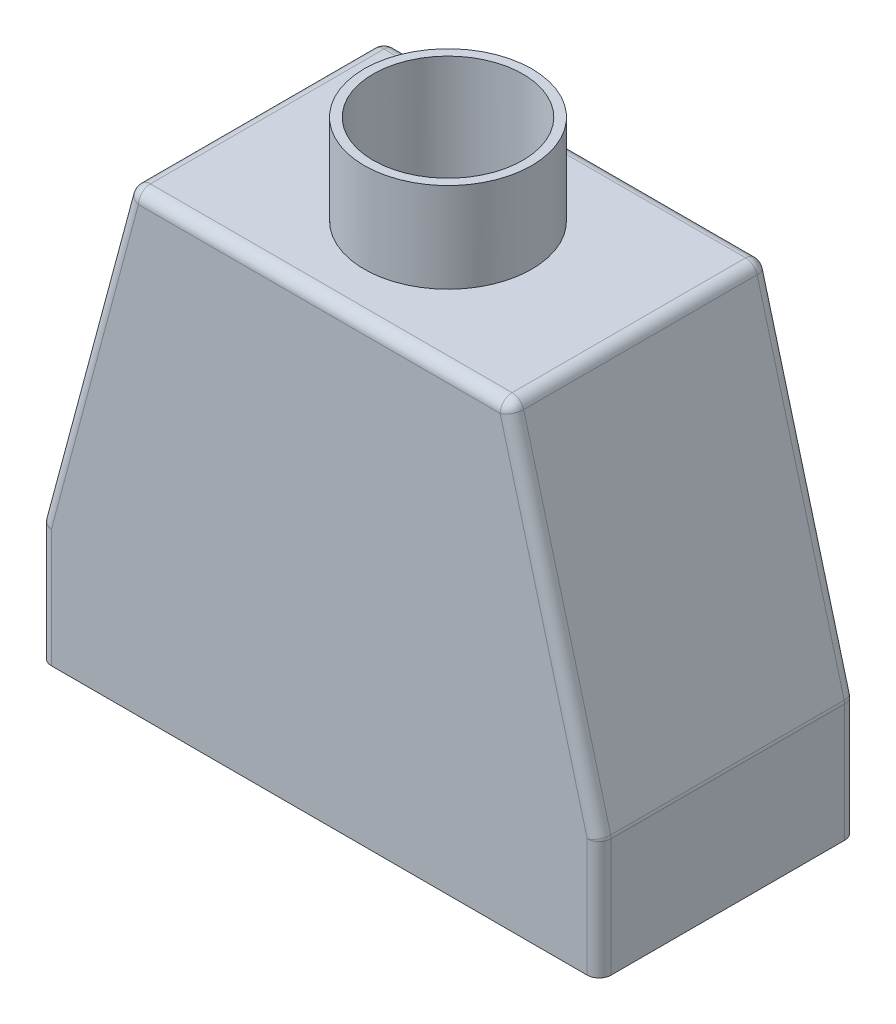
ISO-10303-21;
HEADER;
FILE_DESCRIPTION(('STEP AP214'),'2;1');
FILE_NAME('part.step','',(''),(''),'','','');
FILE_SCHEMA(('AUTOMOTIVE_DESIGN { 1 0 10303 214 1 1 1 1 }'));
ENDSEC;
DATA;
#1=APPLICATION_CONTEXT('core data for automotive mechanical design processes');
#2=APPLICATION_PROTOCOL_DEFINITION('international standard','automotive_design',2000,#1);
#3=PRODUCT_CONTEXT('',#1,'mechanical');
#4=PRODUCT('Part','Part','',(#3));
#5=PRODUCT_RELATED_PRODUCT_CATEGORY('part','',(#4));
#6=PRODUCT_DEFINITION_FORMATION('','',#4);
#7=PRODUCT_DEFINITION_CONTEXT('part definition',#1,'design');
#8=PRODUCT_DEFINITION('design','',#6,#7);
#9=PRODUCT_DEFINITION_SHAPE('','',#8);
#10=(LENGTH_UNIT() NAMED_UNIT(*) SI_UNIT(.MILLI.,.METRE.));
#11=(NAMED_UNIT(*) PLANE_ANGLE_UNIT() SI_UNIT($,.RADIAN.));
#12=(NAMED_UNIT(*) SI_UNIT($,.STERADIAN.) SOLID_ANGLE_UNIT());
#13=UNCERTAINTY_MEASURE_WITH_UNIT(LENGTH_MEASURE(1.E-05),#10,'distance_accuracy_value','');
#14=(GEOMETRIC_REPRESENTATION_CONTEXT(3) GLOBAL_UNCERTAINTY_ASSIGNED_CONTEXT((#13)) GLOBAL_UNIT_ASSIGNED_CONTEXT((#10,
#11,#12)) REPRESENTATION_CONTEXT('',''));
#15=CARTESIAN_POINT('',(0.,0.,0.));
#16=DIRECTION('',(0.,0.,1.));
#17=DIRECTION('',(1.,0.,0.));
#18=AXIS2_PLACEMENT_3D('',#15,#16,#17);
#19=CARTESIAN_POINT('',(31.7448452238571,76.,21.5));
#20=DIRECTION('',(0.,-1.,0.));
#21=DIRECTION('',(0.,0.,-1.));
#22=AXIS2_PLACEMENT_3D('',#19,#20,#21);
#23=PLANE('',#22);
#24=DIRECTION('',(-1.,0.,0.));
#25=VECTOR('',#24,1.);
#26=CARTESIAN_POINT('',(29.6742928630369,76.,19.5));
#27=LINE('',#26,#25);
#28=CARTESIAN_POINT('',(-30.2101912478992,76.,19.5));
#29=VERTEX_POINT('',#28);
#30=CARTESIAN_POINT('',(30.2101912478992,76.,19.5));
#31=VERTEX_POINT('',#30);
#32=EDGE_CURVE('E283',#29,#31,#27,.F.);
#33=ORIENTED_EDGE('',*,*,#32,.T.);
#34=DIRECTION('',(0.,0.,-1.));
#35=VECTOR('',#34,1.);
#36=CARTESIAN_POINT('',(30.2101912478992,76.,21.5));
#37=LINE('',#36,#35);
#38=CARTESIAN_POINT('',(30.2101912478992,76.,-19.5));
#39=VERTEX_POINT('',#38);
#40=EDGE_CURVE('E289',#31,#39,#37,.T.);
#41=ORIENTED_EDGE('',*,*,#40,.T.);
#42=DIRECTION('',(-1.,0.,0.));
#43=VECTOR('',#42,1.);
#44=CARTESIAN_POINT('',(31.7448452238571,76.,-19.5));
#45=LINE('',#44,#43);
#46=CARTESIAN_POINT('',(-30.2101912478992,76.,-19.5));
#47=VERTEX_POINT('',#46);
#48=EDGE_CURVE('E287',#39,#47,#45,.T.);
#49=ORIENTED_EDGE('',*,*,#48,.T.);
#50=DIRECTION('',(0.,0.,-1.));
#51=VECTOR('',#50,1.);
#52=CARTESIAN_POINT('',(-30.2101912478992,76.,21.5));
#53=LINE('',#52,#51);
#54=EDGE_CURVE('E285',#47,#29,#53,.F.);
#55=ORIENTED_EDGE('',*,*,#54,.T.);
#56=EDGE_LOOP('',(#33,#41,#49,#55));
#57=FACE_BOUND('',#56,.T.);
#58=CARTESIAN_POINT('',(0.,76.,0.));
#59=DIRECTION('',(0.,-1.,0.));
#60=DIRECTION('',(0.,0.,-1.));
#61=AXIS2_PLACEMENT_3D('',#58,#59,#60);
#62=CIRCLE('',#61,14.);
#63=CARTESIAN_POINT('',(0.,76.,-14.));
#64=VERTEX_POINT('',#63);
#65=EDGE_CURVE('E258',#64,#64,#62,.F.);
#66=ORIENTED_EDGE('',*,*,#65,.F.);
#67=EDGE_LOOP('',(#66));
#68=FACE_BOUND('',#67,.T.);
#69=ADVANCED_FACE('F34',(#57,#68),#23,.F.);
#70=CARTESIAN_POINT('',(-46.75,0.,21.5));
#71=DIRECTION('',(0.,1.,0.));
#72=DIRECTION('',(0.,0.,1.));
#73=AXIS2_PLACEMENT_3D('',#70,#71,#72);
#74=PLANE('',#73);
#75=DIRECTION('',(1.,0.,0.));
#76=VECTOR('',#75,1.);
#77=CARTESIAN_POINT('',(-46.75,0.,21.5));
#78=LINE('',#77,#76);
#79=CARTESIAN_POINT('',(-44.75,0.,21.5));
#80=VERTEX_POINT('',#79);
#81=CARTESIAN_POINT('',(44.75,0.,21.5));
#82=VERTEX_POINT('',#81);
#83=EDGE_CURVE('E247',#80,#82,#78,.T.);
#84=ORIENTED_EDGE('',*,*,#83,.F.);
#85=CARTESIAN_POINT('',(-44.75,0.,19.5));
#86=DIRECTION('',(0.,1.,0.));
#87=DIRECTION('',(0.,0.,1.));
#88=AXIS2_PLACEMENT_3D('',#85,#86,#87);
#89=CIRCLE('',#88,2.);
#90=CARTESIAN_POINT('',(-46.75,0.,19.5));
#91=VERTEX_POINT('',#90);
#92=EDGE_CURVE('E346',#80,#91,#89,.F.);
#93=ORIENTED_EDGE('',*,*,#92,.T.);
#94=DIRECTION('',(0.,0.,-1.));
#95=VECTOR('',#94,1.);
#96=CARTESIAN_POINT('',(-46.75,0.,21.5));
#97=LINE('',#96,#95);
#98=CARTESIAN_POINT('',(-46.75,0.,-19.5));
#99=VERTEX_POINT('',#98);
#100=EDGE_CURVE('E255',#91,#99,#97,.T.);
#101=ORIENTED_EDGE('',*,*,#100,.T.);
#102=CARTESIAN_POINT('',(-44.75,0.,-19.5));
#103=DIRECTION('',(0.,1.,0.));
#104=DIRECTION('',(0.,0.,1.));
#105=AXIS2_PLACEMENT_3D('',#102,#103,#104);
#106=CIRCLE('',#105,2.);
#107=CARTESIAN_POINT('',(-44.75,0.,-21.5));
#108=VERTEX_POINT('',#107);
#109=EDGE_CURVE('E344',#99,#108,#106,.F.);
#110=ORIENTED_EDGE('',*,*,#109,.T.);
#111=DIRECTION('',(1.,0.,0.));
#112=VECTOR('',#111,1.);
#113=CARTESIAN_POINT('',(-46.75,0.,-21.5));
#114=LINE('',#113,#112);
#115=CARTESIAN_POINT('',(44.75,0.,-21.5));
#116=VERTEX_POINT('',#115);
#117=EDGE_CURVE('E241',#108,#116,#114,.T.);
#118=ORIENTED_EDGE('',*,*,#117,.T.);
#119=CARTESIAN_POINT('',(44.75,0.,-19.5));
#120=DIRECTION('',(0.,1.,0.));
#121=DIRECTION('',(0.,0.,1.));
#122=AXIS2_PLACEMENT_3D('',#119,#120,#121);
#123=CIRCLE('',#122,2.);
#124=CARTESIAN_POINT('',(46.75,0.,-19.5));
#125=VERTEX_POINT('',#124);
#126=EDGE_CURVE('E340',#116,#125,#123,.F.);
#127=ORIENTED_EDGE('',*,*,#126,.T.);
#128=DIRECTION('',(0.,0.,-1.));
#129=VECTOR('',#128,1.);
#130=CARTESIAN_POINT('',(46.75,0.,21.5));
#131=LINE('',#130,#129);
#132=CARTESIAN_POINT('',(46.75,0.,19.5));
#133=VERTEX_POINT('',#132);
#134=EDGE_CURVE('E250',#133,#125,#131,.T.);
#135=ORIENTED_EDGE('',*,*,#134,.F.);
#136=CARTESIAN_POINT('',(44.75,0.,19.5));
#137=DIRECTION('',(0.,1.,0.));
#138=DIRECTION('',(0.,0.,1.));
#139=AXIS2_PLACEMENT_3D('',#136,#137,#138);
#140=CIRCLE('',#139,2.);
#141=EDGE_CURVE('E342',#133,#82,#140,.F.);
#142=ORIENTED_EDGE('',*,*,#141,.T.);
#143=EDGE_LOOP('',(#84,#93,#101,#110,#118,#127,#135,#142));
#144=FACE_BOUND('',#143,.T.);
#145=DIRECTION('',(1.,0.,0.));
#146=VECTOR('',#145,1.);
#147=CARTESIAN_POINT('',(-46.75,0.,-18.5));
#148=LINE('',#147,#146);
#149=CARTESIAN_POINT('',(-43.75,0.,-18.5));
#150=VERTEX_POINT('',#149);
#151=CARTESIAN_POINT('',(43.75,0.,-18.5));
#152=VERTEX_POINT('',#151);
#153=EDGE_CURVE('E210',#150,#152,#148,.T.);
#154=ORIENTED_EDGE('',*,*,#153,.F.);
#155=DIRECTION('',(0.,0.,-1.));
#156=VECTOR('',#155,1.);
#157=CARTESIAN_POINT('',(-43.75,0.,21.5));
#158=LINE('',#157,#156);
#159=CARTESIAN_POINT('',(-43.75,0.,18.5));
#160=VERTEX_POINT('',#159);
#161=EDGE_CURVE('E209',#160,#150,#158,.T.);
#162=ORIENTED_EDGE('',*,*,#161,.F.);
#163=DIRECTION('',(1.,0.,0.));
#164=VECTOR('',#163,1.);
#165=CARTESIAN_POINT('',(-46.75,0.,18.5));
#166=LINE('',#165,#164);
#167=CARTESIAN_POINT('',(43.75,0.,18.5));
#168=VERTEX_POINT('',#167);
#169=EDGE_CURVE('E220',#160,#168,#166,.T.);
#170=ORIENTED_EDGE('',*,*,#169,.T.);
#171=DIRECTION('',(0.,0.,-1.));
#172=VECTOR('',#171,1.);
#173=CARTESIAN_POINT('',(43.75,0.,21.5));
#174=LINE('',#173,#172);
#175=EDGE_CURVE('E238',#168,#152,#174,.T.);
#176=ORIENTED_EDGE('',*,*,#175,.T.);
#177=EDGE_LOOP('',(#154,#162,#170,#176));
#178=FACE_BOUND('',#177,.T.);
#179=ADVANCED_FACE('F408',(#144,#178),#74,.F.);
#180=CARTESIAN_POINT('',(-46.75,0.,21.5));
#181=DIRECTION('',(1.,0.,0.));
#182=DIRECTION('',(0.,0.,-1.));
#183=AXIS2_PLACEMENT_3D('',#180,#181,#182);
#184=PLANE('',#183);
#185=ORIENTED_EDGE('',*,*,#100,.F.);
#186=DIRECTION('',(0.,-1.,0.));
#187=VECTOR('',#186,1.);
#188=CARTESIAN_POINT('',(-46.75,12.2725933896874,19.5));
#189=LINE('',#188,#187);
#190=CARTESIAN_POINT('',(-46.75,19.7366950048252,19.5));
#191=VERTEX_POINT('',#190);
#192=EDGE_CURVE('E352',#91,#191,#189,.F.);
#193=ORIENTED_EDGE('',*,*,#192,.T.);
#194=DIRECTION('',(0.,0.,-1.));
#195=VECTOR('',#194,1.);
#196=CARTESIAN_POINT('',(-46.75,19.7366950048252,21.5));
#197=LINE('',#196,#195);
#198=CARTESIAN_POINT('',(-46.75,19.7366950048252,-19.5));
#199=VERTEX_POINT('',#198);
#200=EDGE_CURVE('E348',#191,#199,#197,.T.);
#201=ORIENTED_EDGE('',*,*,#200,.T.);
#202=DIRECTION('',(0.,-1.,0.));
#203=VECTOR('',#202,1.);
#204=CARTESIAN_POINT('',(-46.75,0.,-19.5));
#205=LINE('',#204,#203);
#206=EDGE_CURVE('E350',#199,#99,#205,.T.);
#207=ORIENTED_EDGE('',*,*,#206,.T.);
#208=EDGE_LOOP('',(#185,#193,#201,#207));
#209=FACE_BOUND('',#208,.T.);
#210=ADVANCED_FACE('F496',(#209),#184,.F.);
#211=CARTESIAN_POINT('',(46.75,0.,21.5));
#212=DIRECTION('',(-1.,0.,0.));
#213=DIRECTION('',(0.,0.,1.));
#214=AXIS2_PLACEMENT_3D('',#211,#212,#213);
#215=PLANE('',#214);
#216=DIRECTION('',(0.,0.,-1.));
#217=VECTOR('',#216,1.);
#218=CARTESIAN_POINT('',(46.75,19.7366950048252,21.5));
#219=LINE('',#218,#217);
#220=CARTESIAN_POINT('',(46.75,19.7366950048252,-19.5));
#221=VERTEX_POINT('',#220);
#222=CARTESIAN_POINT('',(46.75,19.7366950048252,19.5));
#223=VERTEX_POINT('',#222);
#224=EDGE_CURVE('E362',#221,#223,#219,.F.);
#225=ORIENTED_EDGE('',*,*,#224,.T.);
#226=DIRECTION('',(0.,1.,0.));
#227=VECTOR('',#226,1.);
#228=CARTESIAN_POINT('',(46.75,0.,19.5));
#229=LINE('',#228,#227);
#230=EDGE_CURVE('E366',#223,#133,#229,.F.);
#231=ORIENTED_EDGE('',*,*,#230,.T.);
#232=ORIENTED_EDGE('',*,*,#134,.T.);
#233=DIRECTION('',(0.,1.,0.));
#234=VECTOR('',#233,1.);
#235=CARTESIAN_POINT('',(46.75,0.,-19.5));
#236=LINE('',#235,#234);
#237=EDGE_CURVE('E364',#125,#221,#236,.T.);
#238=ORIENTED_EDGE('',*,*,#237,.T.);
#239=EDGE_LOOP('',(#225,#231,#232,#238));
#240=FACE_BOUND('',#239,.T.);
#241=ADVANCED_FACE('F494',(#240),#215,.F.);
#242=CARTESIAN_POINT('',(46.75,20.,21.5));
#243=DIRECTION('',(-0.965925826289068,-0.258819045102521,0.));
#244=DIRECTION('',(0.258819045102521,-0.965925826289068,0.));
#245=AXIS2_PLACEMENT_3D('',#242,#243,#244);
#246=PLANE('',#245);
#247=DIRECTION('',(-0.258819045102521,0.965925826289068,0.));
#248=VECTOR('',#247,1.);
#249=CARTESIAN_POINT('',(46.75,20.,19.5));
#250=LINE('',#249,#248);
#251=CARTESIAN_POINT('',(32.1420429004773,74.5176380902051,19.5));
#252=VERTEX_POINT('',#251);
#253=CARTESIAN_POINT('',(46.6818516525781,20.2543330950303,19.5));
#254=VERTEX_POINT('',#253);
#255=EDGE_CURVE('E271',#252,#254,#250,.F.);
#256=ORIENTED_EDGE('',*,*,#255,.T.);
#257=DIRECTION('',(0.,0.,-1.));
#258=VECTOR('',#257,1.);
#259=CARTESIAN_POINT('',(46.6818516525781,20.2543330950303,21.5));
#260=LINE('',#259,#258);
#261=CARTESIAN_POINT('',(46.6818516525781,20.2543330950303,-19.5));
#262=VERTEX_POINT('',#261);
#263=EDGE_CURVE('E11',#254,#262,#260,.T.);
#264=ORIENTED_EDGE('',*,*,#263,.T.);
#265=DIRECTION('',(-0.258819045102521,0.965925826289068,0.));
#266=VECTOR('',#265,1.);
#267=CARTESIAN_POINT('',(46.75,20.,-19.5));
#268=LINE('',#267,#266);
#269=CARTESIAN_POINT('',(32.1420429004773,74.5176380902051,-19.5));
#270=VERTEX_POINT('',#269);
#271=EDGE_CURVE('E273',#262,#270,#268,.T.);
#272=ORIENTED_EDGE('',*,*,#271,.T.);
#273=DIRECTION('',(0.,0.,-1.));
#274=VECTOR('',#273,1.);
#275=CARTESIAN_POINT('',(32.1420429004773,74.5176380902051,21.5));
#276=LINE('',#275,#274);
#277=EDGE_CURVE('E292',#270,#252,#276,.F.);
#278=ORIENTED_EDGE('',*,*,#277,.T.);
#279=EDGE_LOOP('',(#256,#264,#272,#278));
#280=FACE_BOUND('',#279,.T.);
#281=ADVANCED_FACE('F437',(#280),#246,.F.);
#282=CARTESIAN_POINT('',(-46.75,20.,21.5));
#283=DIRECTION('',(0.965925826289068,-0.258819045102521,0.));
#284=DIRECTION('',(0.258819045102521,0.965925826289068,0.));
#285=AXIS2_PLACEMENT_3D('',#282,#283,#284);
#286=PLANE('',#285);
#287=DIRECTION('',(-0.258819045102521,-0.965925826289068,0.));
#288=VECTOR('',#287,1.);
#289=CARTESIAN_POINT('',(-46.75,20.,-19.5));
#290=LINE('',#289,#288);
#291=CARTESIAN_POINT('',(-32.1420429004773,74.5176380902051,-19.5));
#292=VERTEX_POINT('',#291);
#293=CARTESIAN_POINT('',(-46.6818516525781,20.2543330950303,-19.5));
#294=VERTEX_POINT('',#293);
#295=EDGE_CURVE('E263',#292,#294,#290,.T.);
#296=ORIENTED_EDGE('',*,*,#295,.T.);
#297=DIRECTION('',(0.,0.,-1.));
#298=VECTOR('',#297,1.);
#299=CARTESIAN_POINT('',(-46.6818516525781,20.2543330950303,21.5));
#300=LINE('',#299,#298);
#301=CARTESIAN_POINT('',(-46.6818516525781,20.2543330950303,19.5));
#302=VERTEX_POINT('',#301);
#303=EDGE_CURVE('E43',#294,#302,#300,.F.);
#304=ORIENTED_EDGE('',*,*,#303,.T.);
#305=DIRECTION('',(-0.258819045102521,-0.965925826289068,0.));
#306=VECTOR('',#305,1.);
#307=CARTESIAN_POINT('',(-31.7448452238571,76.,19.5));
#308=LINE('',#307,#306);
#309=CARTESIAN_POINT('',(-32.1420429004773,74.5176380902051,19.5));
#310=VERTEX_POINT('',#309);
#311=EDGE_CURVE('E261',#302,#310,#308,.F.);
#312=ORIENTED_EDGE('',*,*,#311,.T.);
#313=DIRECTION('',(0.,0.,-1.));
#314=VECTOR('',#313,1.);
#315=CARTESIAN_POINT('',(-32.1420429004773,74.5176380902051,21.5));
#316=LINE('',#315,#314);
#317=EDGE_CURVE('E302',#310,#292,#316,.T.);
#318=ORIENTED_EDGE('',*,*,#317,.T.);
#319=EDGE_LOOP('',(#296,#304,#312,#318));
#320=FACE_BOUND('',#319,.T.);
#321=ADVANCED_FACE('F470',(#320),#286,.F.);
#322=CARTESIAN_POINT('',(-46.75,76.,21.5));
#323=DIRECTION('',(0.,0.,1.));
#324=DIRECTION('',(1.,0.,0.));
#325=AXIS2_PLACEMENT_3D('',#322,#323,#324);
#326=PLANE('',#325);
#327=DIRECTION('',(-0.258819045102521,-0.965925826289068,0.));
#328=VECTOR('',#327,1.);
#329=CARTESIAN_POINT('',(-44.8181483474219,19.482361909795,21.5));
#330=LINE('',#329,#328);
#331=CARTESIAN_POINT('',(-30.2101912478992,74.,21.5));
#332=VERTEX_POINT('',#331);
#333=CARTESIAN_POINT('',(-44.75,19.7366950048252,21.5));
#334=VERTEX_POINT('',#333);
#335=EDGE_CURVE('E275',#332,#334,#330,.T.);
#336=ORIENTED_EDGE('',*,*,#335,.T.);
#337=DIRECTION('',(0.,-1.,0.));
#338=VECTOR('',#337,1.);
#339=CARTESIAN_POINT('',(-44.75,0.,21.5));
#340=LINE('',#339,#338);
#341=EDGE_CURVE('E337',#334,#80,#340,.T.);
#342=ORIENTED_EDGE('',*,*,#341,.T.);
#343=ORIENTED_EDGE('',*,*,#83,.T.);
#344=DIRECTION('',(0.,1.,0.));
#345=VECTOR('',#344,1.);
#346=CARTESIAN_POINT('',(44.75,12.2725933896874,21.5));
#347=LINE('',#346,#345);
#348=CARTESIAN_POINT('',(44.75,19.7366950048252,21.5));
#349=VERTEX_POINT('',#348);
#350=EDGE_CURVE('E309',#82,#349,#347,.T.);
#351=ORIENTED_EDGE('',*,*,#350,.T.);
#352=DIRECTION('',(-0.258819045102521,0.965925826289068,0.));
#353=VECTOR('',#352,1.);
#354=CARTESIAN_POINT('',(29.812993571279,75.482361909795,21.5));
#355=LINE('',#354,#353);
#356=CARTESIAN_POINT('',(30.2101912478992,74.,21.5));
#357=VERTEX_POINT('',#356);
#358=EDGE_CURVE('E278',#349,#357,#355,.T.);
#359=ORIENTED_EDGE('',*,*,#358,.T.);
#360=DIRECTION('',(-1.,0.,0.));
#361=VECTOR('',#360,1.);
#362=CARTESIAN_POINT('',(-29.6742928630369,74.,21.5));
#363=LINE('',#362,#361);
#364=EDGE_CURVE('E307',#357,#332,#363,.T.);
#365=ORIENTED_EDGE('',*,*,#364,.T.);
#366=EDGE_LOOP('',(#336,#342,#343,#351,#359,#365));
#367=FACE_BOUND('',#366,.T.);
#368=ADVANCED_FACE('F456',(#367),#326,.T.);
#369=CARTESIAN_POINT('',(-46.75,76.,-21.5));
#370=DIRECTION('',(0.,0.,1.));
#371=DIRECTION('',(1.,0.,0.));
#372=AXIS2_PLACEMENT_3D('',#369,#370,#371);
#373=PLANE('',#372);
#374=ORIENTED_EDGE('',*,*,#117,.F.);
#375=DIRECTION('',(0.,-1.,0.));
#376=VECTOR('',#375,1.);
#377=CARTESIAN_POINT('',(-44.75,76.,-21.5));
#378=LINE('',#377,#376);
#379=CARTESIAN_POINT('',(-44.75,19.7366950048252,-21.5));
#380=VERTEX_POINT('',#379);
#381=EDGE_CURVE('E358',#108,#380,#378,.F.);
#382=ORIENTED_EDGE('',*,*,#381,.T.);
#383=DIRECTION('',(-0.258819045102521,-0.965925826289068,0.));
#384=VECTOR('',#383,1.);
#385=CARTESIAN_POINT('',(-30.8181483474218,71.7310732157592,-21.5));
#386=LINE('',#385,#384);
#387=CARTESIAN_POINT('',(-30.2101912478992,74.,-21.5));
#388=VERTEX_POINT('',#387);
#389=EDGE_CURVE('E269',#380,#388,#386,.F.);
#390=ORIENTED_EDGE('',*,*,#389,.T.);
#391=DIRECTION('',(-1.,0.,0.));
#392=VECTOR('',#391,1.);
#393=CARTESIAN_POINT('',(-46.75,74.,-21.5));
#394=LINE('',#393,#392);
#395=CARTESIAN_POINT('',(30.2101912478992,74.,-21.5));
#396=VERTEX_POINT('',#395);
#397=EDGE_CURVE('E297',#388,#396,#394,.F.);
#398=ORIENTED_EDGE('',*,*,#397,.T.);
#399=DIRECTION('',(-0.258819045102521,0.965925826289068,0.));
#400=VECTOR('',#399,1.);
#401=CARTESIAN_POINT('',(24.5548359743443,95.1060732157593,-21.5));
#402=LINE('',#401,#400);
#403=CARTESIAN_POINT('',(44.75,19.7366950048252,-21.5));
#404=VERTEX_POINT('',#403);
#405=EDGE_CURVE('E266',#396,#404,#402,.F.);
#406=ORIENTED_EDGE('',*,*,#405,.T.);
#407=DIRECTION('',(0.,1.,0.));
#408=VECTOR('',#407,1.);
#409=CARTESIAN_POINT('',(44.75,76.,-21.5));
#410=LINE('',#409,#408);
#411=EDGE_CURVE('E356',#404,#116,#410,.F.);
#412=ORIENTED_EDGE('',*,*,#411,.T.);
#413=EDGE_LOOP('',(#374,#382,#390,#398,#406,#412));
#414=FACE_BOUND('',#413,.T.);
#415=ADVANCED_FACE('F403',(#414),#373,.F.);
#416=CARTESIAN_POINT('',(-43.75,0.,21.5));
#417=DIRECTION('',(1.,0.,0.));
#418=DIRECTION('',(0.,0.,-1.));
#419=AXIS2_PLACEMENT_3D('',#416,#417,#418);
#420=PLANE('',#419);
#421=DIRECTION('',(0.,-1.,0.));
#422=VECTOR('',#421,1.);
#423=CARTESIAN_POINT('',(-43.75,0.,-18.5));
#424=LINE('',#423,#422);
#425=CARTESIAN_POINT('',(-43.75,19.6050425072378,-18.5));
#426=VERTEX_POINT('',#425);
#427=EDGE_CURVE('E189',#426,#150,#424,.T.);
#428=ORIENTED_EDGE('',*,*,#427,.F.);
#429=DIRECTION('',(0.,0.,-1.));
#430=VECTOR('',#429,1.);
#431=CARTESIAN_POINT('',(-43.75,19.6050425072378,21.5));
#432=LINE('',#431,#430);
#433=CARTESIAN_POINT('',(-43.75,19.6050425072378,18.5));
#434=VERTEX_POINT('',#433);
#435=EDGE_CURVE('E199',#434,#426,#432,.T.);
#436=ORIENTED_EDGE('',*,*,#435,.F.);
#437=DIRECTION('',(0.,-1.,0.));
#438=VECTOR('',#437,1.);
#439=CARTESIAN_POINT('',(-43.75,0.,18.5));
#440=LINE('',#439,#438);
#441=EDGE_CURVE('E196',#434,#160,#440,.T.);
#442=ORIENTED_EDGE('',*,*,#441,.T.);
#443=ORIENTED_EDGE('',*,*,#161,.T.);
#444=EDGE_LOOP('',(#428,#436,#442,#443));
#445=FACE_BOUND('',#444,.T.);
#446=ADVANCED_FACE('F207',(#445),#420,.T.);
#447=CARTESIAN_POINT('',(43.75,0.,21.5));
#448=DIRECTION('',(-1.,0.,0.));
#449=DIRECTION('',(0.,0.,1.));
#450=AXIS2_PLACEMENT_3D('',#447,#448,#449);
#451=PLANE('',#450);
#452=DIRECTION('',(0.,1.,0.));
#453=VECTOR('',#452,1.);
#454=CARTESIAN_POINT('',(43.75,0.,-18.5));
#455=LINE('',#454,#453);
#456=CARTESIAN_POINT('',(43.75,19.6050425072378,-18.5));
#457=VERTEX_POINT('',#456);
#458=EDGE_CURVE('E213',#152,#457,#455,.T.);
#459=ORIENTED_EDGE('',*,*,#458,.F.);
#460=ORIENTED_EDGE('',*,*,#175,.F.);
#461=DIRECTION('',(0.,1.,0.));
#462=VECTOR('',#461,1.);
#463=CARTESIAN_POINT('',(43.75,0.,18.5));
#464=LINE('',#463,#462);
#465=CARTESIAN_POINT('',(43.75,19.6050425072378,18.5));
#466=VERTEX_POINT('',#465);
#467=EDGE_CURVE('E235',#168,#466,#464,.T.);
#468=ORIENTED_EDGE('',*,*,#467,.T.);
#469=DIRECTION('',(0.,0.,-1.));
#470=VECTOR('',#469,1.);
#471=CARTESIAN_POINT('',(43.75,19.6050425072378,21.5));
#472=LINE('',#471,#470);
#473=EDGE_CURVE('E232',#466,#457,#472,.T.);
#474=ORIENTED_EDGE('',*,*,#473,.T.);
#475=EDGE_LOOP('',(#459,#460,#468,#474));
#476=FACE_BOUND('',#475,.T.);
#477=ADVANCED_FACE('F535',(#476),#451,.T.);
#478=CARTESIAN_POINT('',(43.8522225211328,19.2235428646924,21.5));
#479=DIRECTION('',(-0.965925826289068,-0.258819045102521,0.));
#480=DIRECTION('',(0.258819045102521,-0.965925826289068,0.));
#481=AXIS2_PLACEMENT_3D('',#478,#479,#480);
#482=PLANE('',#481);
#483=DIRECTION('',(-0.258819045102521,0.965925826289068,0.));
#484=VECTOR('',#483,1.);
#485=CARTESIAN_POINT('',(43.8522225211328,19.2235428646924,-18.5));
#486=LINE('',#485,#484);
#487=CARTESIAN_POINT('',(29.4428642599202,73.,-18.5));
#488=VERTEX_POINT('',#487);
#489=EDGE_CURVE('E227',#457,#488,#486,.T.);
#490=ORIENTED_EDGE('',*,*,#489,.F.);
#491=ORIENTED_EDGE('',*,*,#473,.F.);
#492=DIRECTION('',(-0.258819045102521,0.965925826289068,0.));
#493=VECTOR('',#492,1.);
#494=CARTESIAN_POINT('',(43.8522225211328,19.2235428646924,18.5));
#495=LINE('',#494,#493);
#496=CARTESIAN_POINT('',(29.4428642599202,73.,18.5));
#497=VERTEX_POINT('',#496);
#498=EDGE_CURVE('E229',#466,#497,#495,.T.);
#499=ORIENTED_EDGE('',*,*,#498,.T.);
#500=DIRECTION('',(0.,0.,-1.));
#501=VECTOR('',#500,1.);
#502=CARTESIAN_POINT('',(29.4428642599202,73.,21.5));
#503=LINE('',#502,#501);
#504=EDGE_CURVE('E225',#497,#488,#503,.T.);
#505=ORIENTED_EDGE('',*,*,#504,.T.);
#506=EDGE_LOOP('',(#490,#491,#499,#505));
#507=FACE_BOUND('',#506,.T.);
#508=ADVANCED_FACE('F531',(#507),#482,.T.);
#509=CARTESIAN_POINT('',(31.7448452238571,73.,21.5));
#510=DIRECTION('',(0.,-1.,0.));
#511=DIRECTION('',(0.,0.,-1.));
#512=AXIS2_PLACEMENT_3D('',#509,#510,#511);
#513=PLANE('',#512);
#514=CARTESIAN_POINT('',(0.,73.,0.));
#515=DIRECTION('',(0.,-1.,0.));
#516=DIRECTION('',(0.,0.,-1.));
#517=AXIS2_PLACEMENT_3D('',#514,#515,#516);
#518=CIRCLE('',#517,12.5);
#519=CARTESIAN_POINT('',(0.,73.,-12.5));
#520=VERTEX_POINT('',#519);
#521=EDGE_CURVE('E334',#520,#520,#518,.F.);
#522=ORIENTED_EDGE('',*,*,#521,.T.);
#523=EDGE_LOOP('',(#522));
#524=FACE_BOUND('',#523,.T.);
#525=DIRECTION('',(-1.,0.,0.));
#526=VECTOR('',#525,1.);
#527=CARTESIAN_POINT('',(31.7448452238571,73.,-18.5));
#528=LINE('',#527,#526);
#529=CARTESIAN_POINT('',(-29.4428642599202,73.,-18.5));
#530=VERTEX_POINT('',#529);
#531=EDGE_CURVE('E192',#488,#530,#528,.T.);
#532=ORIENTED_EDGE('',*,*,#531,.F.);
#533=ORIENTED_EDGE('',*,*,#504,.F.);
#534=DIRECTION('',(-1.,0.,0.));
#535=VECTOR('',#534,1.);
#536=CARTESIAN_POINT('',(31.7448452238571,73.,18.5));
#537=LINE('',#536,#535);
#538=CARTESIAN_POINT('',(-29.4428642599202,73.,18.5));
#539=VERTEX_POINT('',#538);
#540=EDGE_CURVE('E223',#497,#539,#537,.T.);
#541=ORIENTED_EDGE('',*,*,#540,.T.);
#542=DIRECTION('',(0.,0.,-1.));
#543=VECTOR('',#542,1.);
#544=CARTESIAN_POINT('',(-29.4428642599202,73.,21.5));
#545=LINE('',#544,#543);
#546=EDGE_CURVE('E205',#539,#530,#545,.T.);
#547=ORIENTED_EDGE('',*,*,#546,.T.);
#548=EDGE_LOOP('',(#532,#533,#541,#547));
#549=FACE_BOUND('',#548,.T.);
#550=ADVANCED_FACE('F528',(#524,#549),#513,.T.);
#551=CARTESIAN_POINT('',(-43.8522225211328,19.2235428646924,21.5));
#552=DIRECTION('',(0.965925826289068,-0.258819045102521,0.));
#553=DIRECTION('',(0.258819045102521,0.965925826289068,0.));
#554=AXIS2_PLACEMENT_3D('',#551,#552,#553);
#555=PLANE('',#554);
#556=DIRECTION('',(-0.258819045102521,-0.965925826289068,0.));
#557=VECTOR('',#556,1.);
#558=CARTESIAN_POINT('',(-43.8522225211328,19.2235428646924,-18.5));
#559=LINE('',#558,#557);
#560=EDGE_CURVE('E185',#530,#426,#559,.T.);
#561=ORIENTED_EDGE('',*,*,#560,.F.);
#562=ORIENTED_EDGE('',*,*,#546,.F.);
#563=DIRECTION('',(-0.258819045102521,-0.965925826289068,0.));
#564=VECTOR('',#563,1.);
#565=CARTESIAN_POINT('',(-43.8522225211328,19.2235428646924,18.5));
#566=LINE('',#565,#564);
#567=EDGE_CURVE('E202',#539,#434,#566,.T.);
#568=ORIENTED_EDGE('',*,*,#567,.T.);
#569=ORIENTED_EDGE('',*,*,#435,.T.);
#570=EDGE_LOOP('',(#561,#562,#568,#569));
#571=FACE_BOUND('',#570,.T.);
#572=ADVANCED_FACE('F200',(#571),#555,.T.);
#573=CARTESIAN_POINT('',(-46.75,76.,18.5));
#574=DIRECTION('',(0.,0.,1.));
#575=DIRECTION('',(1.,0.,0.));
#576=AXIS2_PLACEMENT_3D('',#573,#574,#575);
#577=PLANE('',#576);
#578=ORIENTED_EDGE('',*,*,#441,.F.);
#579=ORIENTED_EDGE('',*,*,#567,.F.);
#580=ORIENTED_EDGE('',*,*,#540,.F.);
#581=ORIENTED_EDGE('',*,*,#498,.F.);
#582=ORIENTED_EDGE('',*,*,#467,.F.);
#583=ORIENTED_EDGE('',*,*,#169,.F.);
#584=EDGE_LOOP('',(#578,#579,#580,#581,#582,#583));
#585=FACE_BOUND('',#584,.T.);
#586=ADVANCED_FACE('F522',(#585),#577,.F.);
#587=CARTESIAN_POINT('',(-46.75,76.,-18.5));
#588=DIRECTION('',(0.,0.,1.));
#589=DIRECTION('',(1.,0.,0.));
#590=AXIS2_PLACEMENT_3D('',#587,#588,#589);
#591=PLANE('',#590);
#592=ORIENTED_EDGE('',*,*,#427,.T.);
#593=ORIENTED_EDGE('',*,*,#153,.T.);
#594=ORIENTED_EDGE('',*,*,#458,.T.);
#595=ORIENTED_EDGE('',*,*,#489,.T.);
#596=ORIENTED_EDGE('',*,*,#531,.T.);
#597=ORIENTED_EDGE('',*,*,#560,.T.);
#598=EDGE_LOOP('',(#592,#593,#594,#595,#596,#597));
#599=FACE_BOUND('',#598,.T.);
#600=ADVANCED_FACE('F187',(#599),#591,.T.);
#601=CARTESIAN_POINT('',(0.,91.,0.));
#602=DIRECTION('',(0.,-1.,0.));
#603=DIRECTION('',(0.,0.,-1.));
#604=AXIS2_PLACEMENT_3D('',#601,#602,#603);
#605=CYLINDRICAL_SURFACE('',#604,14.);
#606=CARTESIAN_POINT('',(0.,91.,0.));
#607=DIRECTION('',(0.,1.,0.));
#608=DIRECTION('',(0.,0.,1.));
#609=AXIS2_PLACEMENT_3D('',#606,#607,#608);
#610=CIRCLE('',#609,14.);
#611=CARTESIAN_POINT('',(0.,91.,14.));
#612=VERTEX_POINT('',#611);
#613=EDGE_CURVE('E211',#612,#612,#610,.T.);
#614=ORIENTED_EDGE('',*,*,#613,.F.);
#615=EDGE_LOOP('',(#614));
#616=FACE_BOUND('',#615,.T.);
#617=ORIENTED_EDGE('',*,*,#65,.T.);
#618=EDGE_LOOP('',(#617));
#619=FACE_BOUND('',#618,.T.);
#620=ADVANCED_FACE('F521',(#616,#619),#605,.T.);
#621=CARTESIAN_POINT('',(0.,91.,0.));
#622=DIRECTION('',(0.,1.,0.));
#623=DIRECTION('',(0.,0.,1.));
#624=AXIS2_PLACEMENT_3D('',#621,#622,#623);
#625=PLANE('',#624);
#626=CARTESIAN_POINT('',(0.,91.,0.));
#627=DIRECTION('',(0.,1.,0.));
#628=DIRECTION('',(0.,0.,1.));
#629=AXIS2_PLACEMENT_3D('',#626,#627,#628);
#630=CIRCLE('',#629,12.5);
#631=CARTESIAN_POINT('',(0.,91.,12.5));
#632=VERTEX_POINT('',#631);
#633=EDGE_CURVE('E216',#632,#632,#630,.T.);
#634=ORIENTED_EDGE('',*,*,#633,.F.);
#635=EDGE_LOOP('',(#634));
#636=FACE_BOUND('',#635,.T.);
#637=ORIENTED_EDGE('',*,*,#613,.T.);
#638=EDGE_LOOP('',(#637));
#639=FACE_BOUND('',#638,.T.);
#640=ADVANCED_FACE('F544',(#636,#639),#625,.T.);
#641=CARTESIAN_POINT('',(0.,-0.00100000000002876,0.));
#642=DIRECTION('',(0.,1.,0.));
#643=DIRECTION('',(0.,0.,1.));
#644=AXIS2_PLACEMENT_3D('',#641,#642,#643);
#645=CYLINDRICAL_SURFACE('',#644,12.5);
#646=ORIENTED_EDGE('',*,*,#521,.F.);
#647=EDGE_LOOP('',(#646));
#648=FACE_BOUND('',#647,.T.);
#649=ORIENTED_EDGE('',*,*,#633,.T.);
#650=EDGE_LOOP('',(#649));
#651=FACE_BOUND('',#650,.T.);
#652=ADVANCED_FACE('F548',(#648,#651),#645,.F.);
#653=CARTESIAN_POINT('',(-44.8181483474219,19.482361909795,-19.5));
#654=DIRECTION('',(-0.258819045102521,-0.965925826289068,0.));
#655=DIRECTION('',(0.965925826289068,-0.258819045102521,0.));
#656=AXIS2_PLACEMENT_3D('',#653,#654,#655);
#657=CYLINDRICAL_SURFACE('',#656,2.);
#658=ORIENTED_EDGE('',*,*,#389,.F.);
#659=CARTESIAN_POINT('',(-44.75,19.7366950048252,-19.5));
#660=DIRECTION('',(-0.258819045102521,-0.965925826289068,0.));
#661=DIRECTION('',(0.965925826289068,-0.258819045102521,0.));
#662=AXIS2_PLACEMENT_3D('',#659,#660,#661);
#663=CIRCLE('',#662,2.);
#664=EDGE_CURVE('E360',#380,#294,#663,.F.);
#665=ORIENTED_EDGE('',*,*,#664,.T.);
#666=ORIENTED_EDGE('',*,*,#295,.F.);
#667=CARTESIAN_POINT('',(-30.2101912478992,74.,-19.5));
#668=DIRECTION('',(-0.258819045102521,-0.965925826289068,0.));
#669=DIRECTION('',(0.965925826289068,-0.258819045102521,0.));
#670=AXIS2_PLACEMENT_3D('',#667,#668,#669);
#671=CIRCLE('',#670,2.);
#672=EDGE_CURVE('E299',#292,#388,#671,.T.);
#673=ORIENTED_EDGE('',*,*,#672,.T.);
#674=EDGE_LOOP('',(#658,#665,#666,#673));
#675=FACE_BOUND('',#674,.T.);
#676=ADVANCED_FACE('F420',(#675),#657,.T.);
#677=CARTESIAN_POINT('',(44.8181483474219,19.482361909795,-19.5));
#678=DIRECTION('',(-0.258819045102521,0.965925826289068,0.));
#679=DIRECTION('',(-0.965925826289068,-0.258819045102521,0.));
#680=AXIS2_PLACEMENT_3D('',#677,#678,#679);
#681=CYLINDRICAL_SURFACE('',#680,2.);
#682=ORIENTED_EDGE('',*,*,#271,.F.);
#683=CARTESIAN_POINT('',(44.75,19.7366950048252,-19.5));
#684=DIRECTION('',(-0.258819045102521,0.965925826289068,0.));
#685=DIRECTION('',(-0.965925826289068,-0.258819045102521,0.));
#686=AXIS2_PLACEMENT_3D('',#683,#684,#685);
#687=CIRCLE('',#686,2.);
#688=EDGE_CURVE('E369',#262,#404,#687,.T.);
#689=ORIENTED_EDGE('',*,*,#688,.T.);
#690=ORIENTED_EDGE('',*,*,#405,.F.);
#691=CARTESIAN_POINT('',(30.2101912478992,74.,-19.5));
#692=DIRECTION('',(-0.258819045102521,0.965925826289068,0.));
#693=DIRECTION('',(-0.965925826289068,-0.258819045102521,0.));
#694=AXIS2_PLACEMENT_3D('',#691,#692,#693);
#695=CIRCLE('',#694,2.);
#696=EDGE_CURVE('E294',#396,#270,#695,.F.);
#697=ORIENTED_EDGE('',*,*,#696,.T.);
#698=EDGE_LOOP('',(#682,#689,#690,#697));
#699=FACE_BOUND('',#698,.T.);
#700=ADVANCED_FACE('F435',(#699),#681,.T.);
#701=CARTESIAN_POINT('',(24.5548359743443,95.1060732157593,19.5));
#702=DIRECTION('',(0.258819045102521,-0.965925826289068,0.));
#703=DIRECTION('',(0.965925826289068,0.258819045102521,0.));
#704=AXIS2_PLACEMENT_3D('',#701,#702,#703);
#705=CYLINDRICAL_SURFACE('',#704,2.);
#706=ORIENTED_EDGE('',*,*,#358,.F.);
#707=CARTESIAN_POINT('',(44.75,19.7366950048252,19.5));
#708=DIRECTION('',(0.258819045102521,-0.965925826289068,0.));
#709=DIRECTION('',(0.965925826289068,0.258819045102521,0.));
#710=AXIS2_PLACEMENT_3D('',#707,#708,#709);
#711=CIRCLE('',#710,2.);
#712=EDGE_CURVE('E57',#349,#254,#711,.F.);
#713=ORIENTED_EDGE('',*,*,#712,.T.);
#714=ORIENTED_EDGE('',*,*,#255,.F.);
#715=CARTESIAN_POINT('',(30.2101912478992,74.,19.5));
#716=DIRECTION('',(0.258819045102521,-0.965925826289068,0.));
#717=DIRECTION('',(0.965925826289068,0.258819045102521,0.));
#718=AXIS2_PLACEMENT_3D('',#715,#716,#717);
#719=CIRCLE('',#718,2.);
#720=EDGE_CURVE('E280',#252,#357,#719,.T.);
#721=ORIENTED_EDGE('',*,*,#720,.T.);
#722=EDGE_LOOP('',(#706,#713,#714,#721));
#723=FACE_BOUND('',#722,.T.);
#724=ADVANCED_FACE('F442',(#723),#705,.T.);
#725=CARTESIAN_POINT('',(-30.8181483474218,71.7310732157592,19.5));
#726=DIRECTION('',(0.258819045102521,0.965925826289068,0.));
#727=DIRECTION('',(-0.965925826289068,0.258819045102521,0.));
#728=AXIS2_PLACEMENT_3D('',#725,#726,#727);
#729=CYLINDRICAL_SURFACE('',#728,2.);
#730=ORIENTED_EDGE('',*,*,#311,.F.);
#731=CARTESIAN_POINT('',(-44.75,19.7366950048252,19.5));
#732=DIRECTION('',(0.258819045102521,0.965925826289068,0.));
#733=DIRECTION('',(-0.965925826289068,0.258819045102521,0.));
#734=AXIS2_PLACEMENT_3D('',#731,#732,#733);
#735=CIRCLE('',#734,2.);
#736=EDGE_CURVE('E354',#302,#334,#735,.T.);
#737=ORIENTED_EDGE('',*,*,#736,.T.);
#738=ORIENTED_EDGE('',*,*,#335,.F.);
#739=CARTESIAN_POINT('',(-30.2101912478992,74.,19.5));
#740=DIRECTION('',(0.258819045102521,0.965925826289068,0.));
#741=DIRECTION('',(-0.965925826289068,0.258819045102521,0.));
#742=AXIS2_PLACEMENT_3D('',#739,#740,#741);
#743=CIRCLE('',#742,2.);
#744=EDGE_CURVE('E304',#332,#310,#743,.F.);
#745=ORIENTED_EDGE('',*,*,#744,.T.);
#746=EDGE_LOOP('',(#730,#737,#738,#745));
#747=FACE_BOUND('',#746,.T.);
#748=ADVANCED_FACE('F461',(#747),#729,.T.);
#749=CARTESIAN_POINT('',(-30.2101912478992,74.,-19.5));
#750=DIRECTION('',(0.,0.,1.));
#751=DIRECTION('',(1.,0.,0.));
#752=AXIS2_PLACEMENT_3D('',#749,#750,#751);
#753=SPHERICAL_SURFACE('',#752,2.);
#754=CARTESIAN_POINT('',(-30.2101912478992,74.,-19.5));
#755=DIRECTION('',(1.,0.,0.));
#756=DIRECTION('',(0.,0.,-1.));
#757=AXIS2_PLACEMENT_3D('',#754,#755,#756);
#758=CIRCLE('',#757,2.);
#759=EDGE_CURVE('E328',#388,#47,#758,.T.);
#760=ORIENTED_EDGE('',*,*,#759,.F.);
#761=ORIENTED_EDGE('',*,*,#672,.F.);
#762=CARTESIAN_POINT('',(-30.2101912478992,74.,-19.5));
#763=DIRECTION('',(0.,0.,1.));
#764=DIRECTION('',(1.,0.,0.));
#765=AXIS2_PLACEMENT_3D('',#762,#763,#764);
#766=CIRCLE('',#765,2.);
#767=EDGE_CURVE('E331',#47,#292,#766,.T.);
#768=ORIENTED_EDGE('',*,*,#767,.F.);
#769=EDGE_LOOP('',(#760,#761,#768));
#770=FACE_BOUND('',#769,.T.);
#771=ADVANCED_FACE('F427',(#770),#753,.T.);
#772=CARTESIAN_POINT('',(-30.2101912478992,74.,21.5));
#773=DIRECTION('',(0.,0.,-1.));
#774=DIRECTION('',(-1.,0.,0.));
#775=AXIS2_PLACEMENT_3D('',#772,#773,#774);
#776=CYLINDRICAL_SURFACE('',#775,2.);
#777=ORIENTED_EDGE('',*,*,#767,.T.);
#778=ORIENTED_EDGE('',*,*,#317,.F.);
#779=CARTESIAN_POINT('',(-30.2101912478992,74.,19.5));
#780=DIRECTION('',(0.,0.,1.));
#781=DIRECTION('',(1.,0.,0.));
#782=AXIS2_PLACEMENT_3D('',#779,#780,#781);
#783=CIRCLE('',#782,2.);
#784=EDGE_CURVE('E325',#29,#310,#783,.T.);
#785=ORIENTED_EDGE('',*,*,#784,.F.);
#786=ORIENTED_EDGE('',*,*,#54,.F.);
#787=EDGE_LOOP('',(#777,#778,#785,#786));
#788=FACE_BOUND('',#787,.T.);
#789=ADVANCED_FACE('F468',(#788),#776,.T.);
#790=CARTESIAN_POINT('',(31.7448452238571,74.,-19.5));
#791=DIRECTION('',(-1.,0.,0.));
#792=DIRECTION('',(0.,0.,1.));
#793=AXIS2_PLACEMENT_3D('',#790,#791,#792);
#794=CYLINDRICAL_SURFACE('',#793,2.);
#795=ORIENTED_EDGE('',*,*,#759,.T.);
#796=ORIENTED_EDGE('',*,*,#48,.F.);
#797=CARTESIAN_POINT('',(30.2101912478992,74.,-19.5));
#798=DIRECTION('',(1.,0.,0.));
#799=DIRECTION('',(0.,1.,0.));
#800=AXIS2_PLACEMENT_3D('',#797,#798,#799);
#801=CIRCLE('',#800,2.);
#802=EDGE_CURVE('E322',#396,#39,#801,.T.);
#803=ORIENTED_EDGE('',*,*,#802,.F.);
#804=ORIENTED_EDGE('',*,*,#397,.F.);
#805=EDGE_LOOP('',(#795,#796,#803,#804));
#806=FACE_BOUND('',#805,.T.);
#807=ADVANCED_FACE('F432',(#806),#794,.T.);
#808=CARTESIAN_POINT('',(-30.2101912478992,74.,19.5));
#809=DIRECTION('',(0.,0.,1.));
#810=DIRECTION('',(1.,0.,0.));
#811=AXIS2_PLACEMENT_3D('',#808,#809,#810);
#812=SPHERICAL_SURFACE('',#811,2.);
#813=ORIENTED_EDGE('',*,*,#784,.T.);
#814=ORIENTED_EDGE('',*,*,#744,.F.);
#815=CARTESIAN_POINT('',(-30.2101912478992,74.,19.5));
#816=DIRECTION('',(1.,0.,0.));
#817=DIRECTION('',(0.,0.,-1.));
#818=AXIS2_PLACEMENT_3D('',#815,#816,#817);
#819=CIRCLE('',#818,2.);
#820=EDGE_CURVE('E319',#29,#332,#819,.T.);
#821=ORIENTED_EDGE('',*,*,#820,.F.);
#822=EDGE_LOOP('',(#813,#814,#821));
#823=FACE_BOUND('',#822,.T.);
#824=ADVANCED_FACE('F465',(#823),#812,.T.);
#825=CARTESIAN_POINT('',(30.2101912478992,74.,-19.5));
#826=DIRECTION('',(0.,0.,1.));
#827=DIRECTION('',(1.,0.,0.));
#828=AXIS2_PLACEMENT_3D('',#825,#826,#827);
#829=SPHERICAL_SURFACE('',#828,2.);
#830=ORIENTED_EDGE('',*,*,#696,.F.);
#831=ORIENTED_EDGE('',*,*,#802,.T.);
#832=CARTESIAN_POINT('',(30.2101912478992,74.,-19.5));
#833=DIRECTION('',(0.,0.,1.));
#834=DIRECTION('',(1.,0.,0.));
#835=AXIS2_PLACEMENT_3D('',#832,#833,#834);
#836=CIRCLE('',#835,2.);
#837=EDGE_CURVE('E317',#270,#39,#836,.T.);
#838=ORIENTED_EDGE('',*,*,#837,.F.);
#839=EDGE_LOOP('',(#830,#831,#838));
#840=FACE_BOUND('',#839,.T.);
#841=ADVANCED_FACE('F590',(#840),#829,.T.);
#842=CARTESIAN_POINT('',(-46.75,74.,19.5));
#843=DIRECTION('',(1.,0.,0.));
#844=DIRECTION('',(0.,0.,-1.));
#845=AXIS2_PLACEMENT_3D('',#842,#843,#844);
#846=CYLINDRICAL_SURFACE('',#845,2.);
#847=ORIENTED_EDGE('',*,*,#820,.T.);
#848=ORIENTED_EDGE('',*,*,#364,.F.);
#849=CARTESIAN_POINT('',(30.2101912478992,74.,19.5));
#850=DIRECTION('',(1.,0.,0.));
#851=DIRECTION('',(0.,0.,-1.));
#852=AXIS2_PLACEMENT_3D('',#849,#850,#851);
#853=CIRCLE('',#852,2.);
#854=EDGE_CURVE('E313',#31,#357,#853,.T.);
#855=ORIENTED_EDGE('',*,*,#854,.F.);
#856=ORIENTED_EDGE('',*,*,#32,.F.);
#857=EDGE_LOOP('',(#847,#848,#855,#856));
#858=FACE_BOUND('',#857,.T.);
#859=ADVANCED_FACE('F452',(#858),#846,.T.);
#860=CARTESIAN_POINT('',(30.2101912478992,74.,21.5));
#861=DIRECTION('',(0.,0.,-1.));
#862=DIRECTION('',(-1.,0.,0.));
#863=AXIS2_PLACEMENT_3D('',#860,#861,#862);
#864=CYLINDRICAL_SURFACE('',#863,2.);
#865=ORIENTED_EDGE('',*,*,#837,.T.);
#866=ORIENTED_EDGE('',*,*,#40,.F.);
#867=CARTESIAN_POINT('',(30.2101912478992,74.,19.5));
#868=DIRECTION('',(0.,0.,1.));
#869=DIRECTION('',(1.,0.,0.));
#870=AXIS2_PLACEMENT_3D('',#867,#868,#869);
#871=CIRCLE('',#870,2.);
#872=EDGE_CURVE('E310',#252,#31,#871,.T.);
#873=ORIENTED_EDGE('',*,*,#872,.F.);
#874=ORIENTED_EDGE('',*,*,#277,.F.);
#875=EDGE_LOOP('',(#865,#866,#873,#874));
#876=FACE_BOUND('',#875,.T.);
#877=ADVANCED_FACE('F448',(#876),#864,.T.);
#878=CARTESIAN_POINT('',(30.2101912478992,74.,19.5));
#879=DIRECTION('',(0.,0.,1.));
#880=DIRECTION('',(1.,0.,0.));
#881=AXIS2_PLACEMENT_3D('',#878,#879,#880);
#882=SPHERICAL_SURFACE('',#881,2.);
#883=ORIENTED_EDGE('',*,*,#854,.T.);
#884=ORIENTED_EDGE('',*,*,#720,.F.);
#885=ORIENTED_EDGE('',*,*,#872,.T.);
#886=EDGE_LOOP('',(#883,#884,#885));
#887=FACE_BOUND('',#886,.T.);
#888=ADVANCED_FACE('F444',(#887),#882,.T.);
#889=CARTESIAN_POINT('',(-44.75,0.,-19.5));
#890=DIRECTION('',(0.,-1.,0.));
#891=DIRECTION('',(0.,0.,-1.));
#892=AXIS2_PLACEMENT_3D('',#889,#890,#891);
#893=CYLINDRICAL_SURFACE('',#892,2.);
#894=CARTESIAN_POINT('',(-44.75,19.7366950048252,-19.5));
#895=DIRECTION('',(0.,1.,0.));
#896=DIRECTION('',(0.,0.,1.));
#897=AXIS2_PLACEMENT_3D('',#894,#895,#896);
#898=CIRCLE('',#897,2.);
#899=EDGE_CURVE('E314',#380,#199,#898,.T.);
#900=ORIENTED_EDGE('',*,*,#899,.F.);
#901=ORIENTED_EDGE('',*,*,#381,.F.);
#902=ORIENTED_EDGE('',*,*,#109,.F.);
#903=ORIENTED_EDGE('',*,*,#206,.F.);
#904=EDGE_LOOP('',(#900,#901,#902,#903));
#905=FACE_BOUND('',#904,.T.);
#906=ADVANCED_FACE('F416',(#905),#893,.T.);
#907=CARTESIAN_POINT('',(-44.75,19.7366950048252,-19.5));
#908=DIRECTION('',(0.,0.,1.));
#909=DIRECTION('',(1.,0.,0.));
#910=AXIS2_PLACEMENT_3D('',#907,#908,#909);
#911=SPHERICAL_SURFACE('',#910,2.);
#912=ORIENTED_EDGE('',*,*,#664,.F.);
#913=ORIENTED_EDGE('',*,*,#899,.T.);
#914=CARTESIAN_POINT('',(-44.75,19.7366950048252,-19.5));
#915=DIRECTION('',(0.,0.,1.));
#916=DIRECTION('',(1.,0.,0.));
#917=AXIS2_PLACEMENT_3D('',#914,#915,#916);
#918=CIRCLE('',#917,2.);
#919=EDGE_CURVE('E378',#294,#199,#918,.T.);
#920=ORIENTED_EDGE('',*,*,#919,.F.);
#921=EDGE_LOOP('',(#912,#913,#920));
#922=FACE_BOUND('',#921,.T.);
#923=ADVANCED_FACE('F608',(#922),#911,.T.);
#924=CARTESIAN_POINT('',(-44.75,19.7366950048252,21.5));
#925=DIRECTION('',(0.,0.,-1.));
#926=DIRECTION('',(-1.,0.,0.));
#927=AXIS2_PLACEMENT_3D('',#924,#925,#926);
#928=CYLINDRICAL_SURFACE('',#927,2.);
#929=CARTESIAN_POINT('',(-44.75,19.7366950048252,19.5));
#930=DIRECTION('',(0.,0.,1.));
#931=DIRECTION('',(1.,0.,0.));
#932=AXIS2_PLACEMENT_3D('',#929,#930,#931);
#933=CIRCLE('',#932,2.);
#934=EDGE_CURVE('E375',#302,#191,#933,.T.);
#935=ORIENTED_EDGE('',*,*,#934,.F.);
#936=ORIENTED_EDGE('',*,*,#303,.F.);
#937=ORIENTED_EDGE('',*,*,#919,.T.);
#938=ORIENTED_EDGE('',*,*,#200,.F.);
#939=EDGE_LOOP('',(#935,#936,#937,#938));
#940=FACE_BOUND('',#939,.T.);
#941=ADVANCED_FACE('F476',(#940),#928,.T.);
#942=CARTESIAN_POINT('',(-44.75,19.7366950048252,19.5));
#943=DIRECTION('',(0.,0.,1.));
#944=DIRECTION('',(1.,0.,0.));
#945=AXIS2_PLACEMENT_3D('',#942,#943,#944);
#946=SPHERICAL_SURFACE('',#945,2.);
#947=ORIENTED_EDGE('',*,*,#736,.F.);
#948=ORIENTED_EDGE('',*,*,#934,.T.);
#949=CARTESIAN_POINT('',(-44.75,19.7366950048252,19.5));
#950=DIRECTION('',(0.,-1.,0.));
#951=DIRECTION('',(0.,0.,-1.));
#952=AXIS2_PLACEMENT_3D('',#949,#950,#951);
#953=CIRCLE('',#952,2.);
#954=EDGE_CURVE('E372',#334,#191,#953,.T.);
#955=ORIENTED_EDGE('',*,*,#954,.F.);
#956=EDGE_LOOP('',(#947,#948,#955));
#957=FACE_BOUND('',#956,.T.);
#958=ADVANCED_FACE('F478',(#957),#946,.T.);
#959=CARTESIAN_POINT('',(-44.75,76.,19.5));
#960=DIRECTION('',(0.,1.,0.));
#961=DIRECTION('',(0.,0.,1.));
#962=AXIS2_PLACEMENT_3D('',#959,#960,#961);
#963=CYLINDRICAL_SURFACE('',#962,2.);
#964=ORIENTED_EDGE('',*,*,#954,.T.);
#965=ORIENTED_EDGE('',*,*,#192,.F.);
#966=ORIENTED_EDGE('',*,*,#92,.F.);
#967=ORIENTED_EDGE('',*,*,#341,.F.);
#968=EDGE_LOOP('',(#964,#965,#966,#967));
#969=FACE_BOUND('',#968,.T.);
#970=ADVANCED_FACE('F482',(#969),#963,.T.);
#971=CARTESIAN_POINT('',(44.75,0.,-19.5));
#972=DIRECTION('',(0.,1.,0.));
#973=DIRECTION('',(0.,0.,1.));
#974=AXIS2_PLACEMENT_3D('',#971,#972,#973);
#975=CYLINDRICAL_SURFACE('',#974,2.);
#976=ORIENTED_EDGE('',*,*,#126,.F.);
#977=ORIENTED_EDGE('',*,*,#411,.F.);
#978=CARTESIAN_POINT('',(44.75,19.7366950048252,-19.5));
#979=DIRECTION('',(0.,1.,0.));
#980=DIRECTION('',(0.,0.,1.));
#981=AXIS2_PLACEMENT_3D('',#978,#979,#980);
#982=CIRCLE('',#981,2.);
#983=EDGE_CURVE('E38',#221,#404,#982,.T.);
#984=ORIENTED_EDGE('',*,*,#983,.F.);
#985=ORIENTED_EDGE('',*,*,#237,.F.);
#986=EDGE_LOOP('',(#976,#977,#984,#985));
#987=FACE_BOUND('',#986,.T.);
#988=ADVANCED_FACE('F36',(#987),#975,.T.);
#989=CARTESIAN_POINT('',(44.75,19.7366950048252,-19.5));
#990=DIRECTION('',(0.,0.,1.));
#991=DIRECTION('',(1.,0.,0.));
#992=AXIS2_PLACEMENT_3D('',#989,#990,#991);
#993=SPHERICAL_SURFACE('',#992,2.);
#994=ORIENTED_EDGE('',*,*,#983,.T.);
#995=ORIENTED_EDGE('',*,*,#688,.F.);
#996=CARTESIAN_POINT('',(44.75,19.7366950048252,-19.5));
#997=DIRECTION('',(0.,0.,1.));
#998=DIRECTION('',(1.,0.,0.));
#999=AXIS2_PLACEMENT_3D('',#996,#997,#998);
#1000=CIRCLE('',#999,2.);
#1001=EDGE_CURVE('E387',#221,#262,#1000,.T.);
#1002=ORIENTED_EDGE('',*,*,#1001,.F.);
#1003=EDGE_LOOP('',(#994,#995,#1002));
#1004=FACE_BOUND('',#1003,.T.);
#1005=ADVANCED_FACE('F396',(#1004),#993,.T.);
#1006=CARTESIAN_POINT('',(44.75,19.7366950048252,21.5));
#1007=DIRECTION('',(0.,0.,-1.));
#1008=DIRECTION('',(-1.,0.,0.));
#1009=AXIS2_PLACEMENT_3D('',#1006,#1007,#1008);
#1010=CYLINDRICAL_SURFACE('',#1009,2.);
#1011=ORIENTED_EDGE('',*,*,#1001,.T.);
#1012=ORIENTED_EDGE('',*,*,#263,.F.);
#1013=CARTESIAN_POINT('',(44.75,19.7366950048252,19.5));
#1014=DIRECTION('',(0.,0.,1.));
#1015=DIRECTION('',(1.,0.,0.));
#1016=AXIS2_PLACEMENT_3D('',#1013,#1014,#1015);
#1017=CIRCLE('',#1016,2.);
#1018=EDGE_CURVE('E385',#223,#254,#1017,.T.);
#1019=ORIENTED_EDGE('',*,*,#1018,.F.);
#1020=ORIENTED_EDGE('',*,*,#224,.F.);
#1021=EDGE_LOOP('',(#1011,#1012,#1019,#1020));
#1022=FACE_BOUND('',#1021,.T.);
#1023=ADVANCED_FACE('F492',(#1022),#1010,.T.);
#1024=CARTESIAN_POINT('',(44.75,19.7366950048252,19.5));
#1025=DIRECTION('',(0.,0.,1.));
#1026=DIRECTION('',(1.,0.,0.));
#1027=AXIS2_PLACEMENT_3D('',#1024,#1025,#1026);
#1028=SPHERICAL_SURFACE('',#1027,2.);
#1029=ORIENTED_EDGE('',*,*,#1018,.T.);
#1030=ORIENTED_EDGE('',*,*,#712,.F.);
#1031=CARTESIAN_POINT('',(44.75,19.7366950048252,19.5));
#1032=DIRECTION('',(0.,-1.,0.));
#1033=DIRECTION('',(0.,0.,-1.));
#1034=AXIS2_PLACEMENT_3D('',#1031,#1032,#1033);
#1035=CIRCLE('',#1034,2.);
#1036=EDGE_CURVE('E383',#223,#349,#1035,.T.);
#1037=ORIENTED_EDGE('',*,*,#1036,.F.);
#1038=EDGE_LOOP('',(#1029,#1030,#1037));
#1039=FACE_BOUND('',#1038,.T.);
#1040=ADVANCED_FACE('F490',(#1039),#1028,.T.);
#1041=CARTESIAN_POINT('',(44.75,76.,19.5));
#1042=DIRECTION('',(0.,-1.,0.));
#1043=DIRECTION('',(0.,0.,-1.));
#1044=AXIS2_PLACEMENT_3D('',#1041,#1042,#1043);
#1045=CYLINDRICAL_SURFACE('',#1044,2.);
#1046=ORIENTED_EDGE('',*,*,#141,.F.);
#1047=ORIENTED_EDGE('',*,*,#230,.F.);
#1048=ORIENTED_EDGE('',*,*,#1036,.T.);
#1049=ORIENTED_EDGE('',*,*,#350,.F.);
#1050=EDGE_LOOP('',(#1046,#1047,#1048,#1049));
#1051=FACE_BOUND('',#1050,.T.);
#1052=ADVANCED_FACE('F487',(#1051),#1045,.T.);
#1053=CLOSED_SHELL('',(#69,#179,#210,#241,#281,#321,#368,#415,#446,#477,#508,#550,#572,#586,
#600,#620,#640,#652,#676,#700,#724,#748,#771,#789,#807,#824,#841,#859,#877,#888,#906,#923,#941,
#958,#970,#988,#1005,#1023,#1040,#1052));
#1054=MANIFOLD_SOLID_BREP('B2',#1053);
#1055=ADVANCED_BREP_SHAPE_REPRESENTATION('',(#18,#1054),#14);
#1056=SHAPE_DEFINITION_REPRESENTATION(#9,#1055);
ENDSEC;
END-ISO-10303-21;
